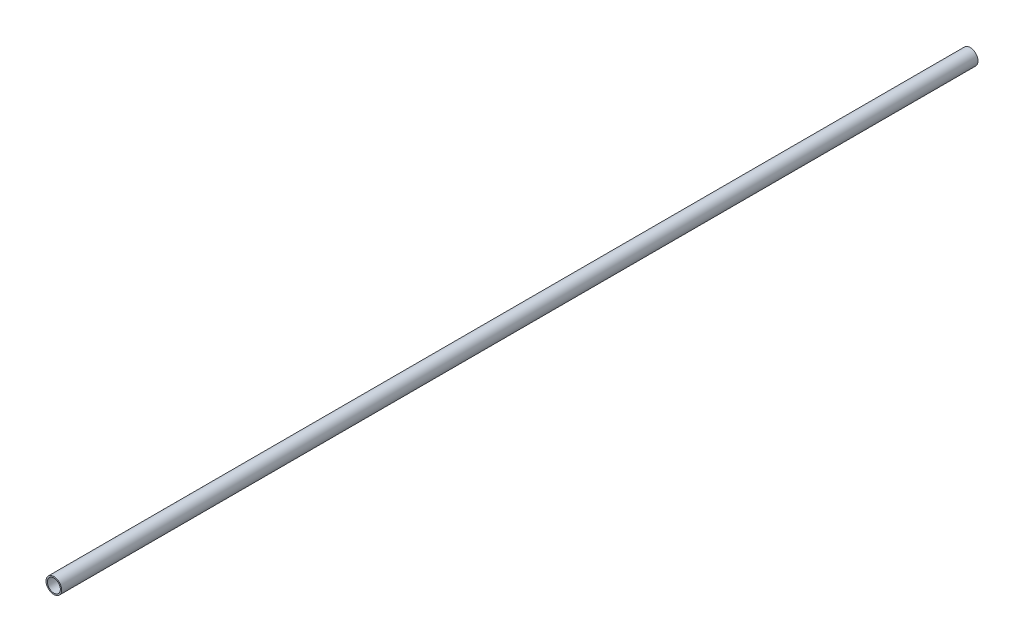
ISO-10303-21;
HEADER;
FILE_DESCRIPTION(('STEP AP214'),'2;1');
FILE_NAME('part.step','',(''),(''),'','','');
FILE_SCHEMA(('AUTOMOTIVE_DESIGN { 1 0 10303 214 1 1 1 1 }'));
ENDSEC;
DATA;
#1=APPLICATION_CONTEXT('core data for automotive mechanical design processes');
#2=APPLICATION_PROTOCOL_DEFINITION('international standard','automotive_design',2000,#1);
#3=PRODUCT_CONTEXT('',#1,'mechanical');
#4=PRODUCT('Part','Part','',(#3));
#5=PRODUCT_RELATED_PRODUCT_CATEGORY('part','',(#4));
#6=PRODUCT_DEFINITION_FORMATION('','',#4);
#7=PRODUCT_DEFINITION_CONTEXT('part definition',#1,'design');
#8=PRODUCT_DEFINITION('design','',#6,#7);
#9=PRODUCT_DEFINITION_SHAPE('','',#8);
#10=(LENGTH_UNIT() NAMED_UNIT(*) SI_UNIT(.MILLI.,.METRE.));
#11=(NAMED_UNIT(*) PLANE_ANGLE_UNIT() SI_UNIT($,.RADIAN.));
#12=(NAMED_UNIT(*) SI_UNIT($,.STERADIAN.) SOLID_ANGLE_UNIT());
#13=UNCERTAINTY_MEASURE_WITH_UNIT(LENGTH_MEASURE(1.E-05),#10,'distance_accuracy_value','');
#14=(GEOMETRIC_REPRESENTATION_CONTEXT(3) GLOBAL_UNCERTAINTY_ASSIGNED_CONTEXT((#13)) GLOBAL_UNIT_ASSIGNED_CONTEXT((#10,
#11,#12)) REPRESENTATION_CONTEXT('',''));
#15=CARTESIAN_POINT('',(0.,0.,0.));
#16=DIRECTION('',(0.,0.,1.));
#17=DIRECTION('',(1.,0.,0.));
#18=AXIS2_PLACEMENT_3D('',#15,#16,#17);
#19=CARTESIAN_POINT('',(0.,0.,2463.8));
#20=DIRECTION('',(0.,0.,1.));
#21=DIRECTION('',(1.,0.,0.));
#22=AXIS2_PLACEMENT_3D('',#19,#20,#21);
#23=PLANE('',#22);
#24=CARTESIAN_POINT('',(0.,0.,2463.8));
#25=DIRECTION('',(0.,0.,1.));
#26=DIRECTION('',(1.,0.,0.));
#27=AXIS2_PLACEMENT_3D('',#24,#25,#26);
#28=CIRCLE('',#27,21.082);
#29=CARTESIAN_POINT('',(21.082,0.,2463.8));
#30=VERTEX_POINT('',#29);
#31=EDGE_CURVE('E10',#30,#30,#28,.T.);
#32=ORIENTED_EDGE('',*,*,#31,.T.);
#33=EDGE_LOOP('',(#32));
#34=FACE_BOUND('',#33,.T.);
#35=CARTESIAN_POINT('',(0.,0.,2463.8));
#36=DIRECTION('',(0.,0.,1.));
#37=DIRECTION('',(1.,0.,0.));
#38=AXIS2_PLACEMENT_3D('',#35,#36,#37);
#39=CIRCLE('',#38,17.526);
#40=CARTESIAN_POINT('',(17.526,0.,2463.8));
#41=VERTEX_POINT('',#40);
#42=EDGE_CURVE('E43',#41,#41,#39,.T.);
#43=ORIENTED_EDGE('',*,*,#42,.F.);
#44=EDGE_LOOP('',(#43));
#45=FACE_BOUND('',#44,.T.);
#46=ADVANCED_FACE('F32',(#34,#45),#23,.T.);
#47=CARTESIAN_POINT('',(0.,0.,0.));
#48=DIRECTION('',(0.,0.,1.));
#49=DIRECTION('',(1.,0.,0.));
#50=AXIS2_PLACEMENT_3D('',#47,#48,#49);
#51=PLANE('',#50);
#52=CARTESIAN_POINT('',(0.,0.,0.));
#53=DIRECTION('',(0.,0.,1.));
#54=DIRECTION('',(1.,0.,0.));
#55=AXIS2_PLACEMENT_3D('',#52,#53,#54);
#56=CIRCLE('',#55,21.082);
#57=CARTESIAN_POINT('',(21.082,0.,0.));
#58=VERTEX_POINT('',#57);
#59=EDGE_CURVE('E36',#58,#58,#56,.T.);
#60=ORIENTED_EDGE('',*,*,#59,.F.);
#61=EDGE_LOOP('',(#60));
#62=FACE_BOUND('',#61,.T.);
#63=CARTESIAN_POINT('',(0.,0.,0.));
#64=DIRECTION('',(0.,0.,1.));
#65=DIRECTION('',(1.,0.,0.));
#66=AXIS2_PLACEMENT_3D('',#63,#64,#65);
#67=CIRCLE('',#66,17.526);
#68=CARTESIAN_POINT('',(17.526,0.,0.));
#69=VERTEX_POINT('',#68);
#70=EDGE_CURVE('E45',#69,#69,#67,.T.);
#71=ORIENTED_EDGE('',*,*,#70,.T.);
#72=EDGE_LOOP('',(#71));
#73=FACE_BOUND('',#72,.T.);
#74=ADVANCED_FACE('F55',(#62,#73),#51,.F.);
#75=CARTESIAN_POINT('',(0.,0.,2463.8));
#76=DIRECTION('',(0.,0.,-1.));
#77=DIRECTION('',(-1.,0.,0.));
#78=AXIS2_PLACEMENT_3D('',#75,#76,#77);
#79=CYLINDRICAL_SURFACE('',#78,21.082);
#80=ORIENTED_EDGE('',*,*,#31,.F.);
#81=EDGE_LOOP('',(#80));
#82=FACE_BOUND('',#81,.T.);
#83=ORIENTED_EDGE('',*,*,#59,.T.);
#84=EDGE_LOOP('',(#83));
#85=FACE_BOUND('',#84,.T.);
#86=ADVANCED_FACE('F34',(#82,#85),#79,.T.);
#87=CARTESIAN_POINT('',(0.,0.,2463.8));
#88=DIRECTION('',(0.,0.,-1.));
#89=DIRECTION('',(-1.,0.,0.));
#90=AXIS2_PLACEMENT_3D('',#87,#88,#89);
#91=CYLINDRICAL_SURFACE('',#90,17.526);
#92=ORIENTED_EDGE('',*,*,#42,.T.);
#93=EDGE_LOOP('',(#92));
#94=FACE_BOUND('',#93,.T.);
#95=ORIENTED_EDGE('',*,*,#70,.F.);
#96=EDGE_LOOP('',(#95));
#97=FACE_BOUND('',#96,.T.);
#98=ADVANCED_FACE('F51',(#94,#97),#91,.F.);
#99=CLOSED_SHELL('',(#46,#74,#86,#98));
#100=MANIFOLD_SOLID_BREP('B2',#99);
#101=ADVANCED_BREP_SHAPE_REPRESENTATION('',(#18,#100),#14);
#102=SHAPE_DEFINITION_REPRESENTATION(#9,#101);
ENDSEC;
END-ISO-10303-21;
